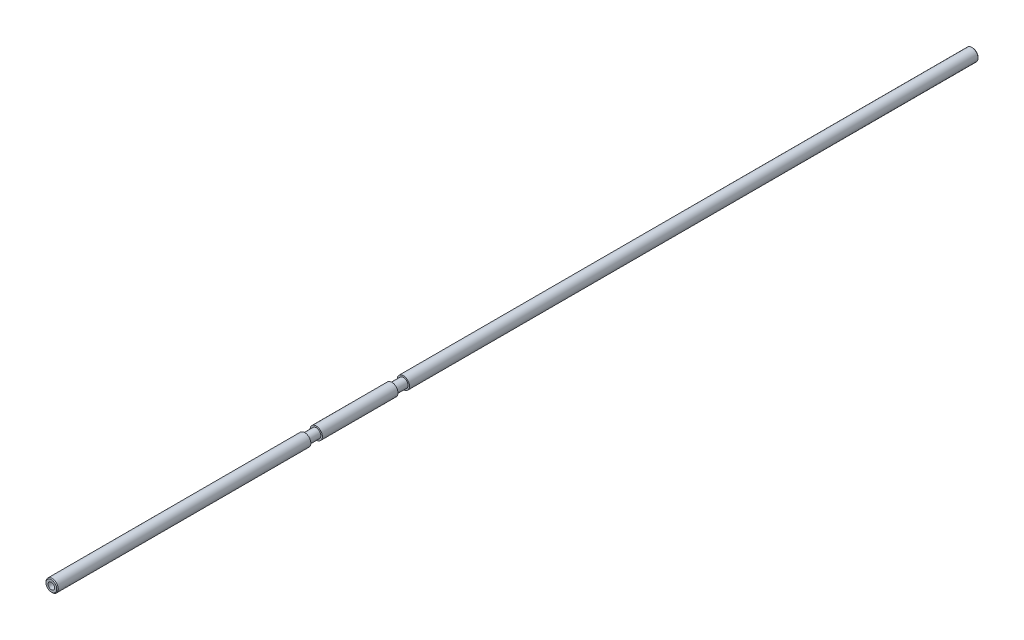
ISO-10303-21;
HEADER;
FILE_DESCRIPTION(('STEP AP214'),'2;1');
FILE_NAME('part.step','',(''),(''),'','','');
FILE_SCHEMA(('AUTOMOTIVE_DESIGN { 1 0 10303 214 1 1 1 1 }'));
ENDSEC;
DATA;
#1=APPLICATION_CONTEXT('core data for automotive mechanical design processes');
#2=APPLICATION_PROTOCOL_DEFINITION('international standard','automotive_design',2000,#1);
#3=PRODUCT_CONTEXT('',#1,'mechanical');
#4=PRODUCT('Part','Part','',(#3));
#5=PRODUCT_RELATED_PRODUCT_CATEGORY('part','',(#4));
#6=PRODUCT_DEFINITION_FORMATION('','',#4);
#7=PRODUCT_DEFINITION_CONTEXT('part definition',#1,'design');
#8=PRODUCT_DEFINITION('design','',#6,#7);
#9=PRODUCT_DEFINITION_SHAPE('','',#8);
#10=(LENGTH_UNIT() NAMED_UNIT(*) SI_UNIT(.MILLI.,.METRE.));
#11=(NAMED_UNIT(*) PLANE_ANGLE_UNIT() SI_UNIT($,.RADIAN.));
#12=(NAMED_UNIT(*) SI_UNIT($,.STERADIAN.) SOLID_ANGLE_UNIT());
#13=UNCERTAINTY_MEASURE_WITH_UNIT(LENGTH_MEASURE(1.E-05),#10,'distance_accuracy_value','');
#14=(GEOMETRIC_REPRESENTATION_CONTEXT(3) GLOBAL_UNCERTAINTY_ASSIGNED_CONTEXT((#13)) GLOBAL_UNIT_ASSIGNED_CONTEXT((#10,
#11,#12)) REPRESENTATION_CONTEXT('',''));
#15=CARTESIAN_POINT('',(0.,0.,0.));
#16=DIRECTION('',(0.,0.,1.));
#17=DIRECTION('',(1.,0.,0.));
#18=AXIS2_PLACEMENT_3D('',#15,#16,#17);
#19=CARTESIAN_POINT('',(45.,0.,1210.));
#20=DIRECTION('',(0.,0.,-1.));
#21=DIRECTION('',(-1.,0.,0.));
#22=AXIS2_PLACEMENT_3D('',#19,#20,#21);
#23=CYLINDRICAL_SURFACE('',#22,8.);
#24=CARTESIAN_POINT('',(45.,0.,766.5));
#25=DIRECTION('',(0.,0.,1.));
#26=DIRECTION('',(1.,0.,0.));
#27=AXIS2_PLACEMENT_3D('',#24,#25,#26);
#28=CIRCLE('',#27,8.);
#29=CARTESIAN_POINT('',(53.,0.,766.5));
#30=VERTEX_POINT('',#29);
#31=EDGE_CURVE('E73',#30,#30,#28,.T.);
#32=ORIENTED_EDGE('',*,*,#31,.T.);
#33=EDGE_LOOP('',(#32));
#34=FACE_BOUND('',#33,.T.);
#35=CARTESIAN_POINT('',(45.,0.,865.));
#36=DIRECTION('',(0.,0.,1.));
#37=DIRECTION('',(1.,0.,0.));
#38=AXIS2_PLACEMENT_3D('',#35,#36,#37);
#39=CIRCLE('',#38,8.);
#40=CARTESIAN_POINT('',(53.,0.,865.));
#41=VERTEX_POINT('',#40);
#42=EDGE_CURVE('E82',#41,#41,#39,.T.);
#43=ORIENTED_EDGE('',*,*,#42,.F.);
#44=EDGE_LOOP('',(#43));
#45=FACE_BOUND('',#44,.T.);
#46=ADVANCED_FACE('F39',(#34,#45),#23,.T.);
#47=CARTESIAN_POINT('',(45.,0.,10.9999999999997));
#48=DIRECTION('',(0.,0.,1.));
#49=DIRECTION('',(1.,0.,0.));
#50=AXIS2_PLACEMENT_3D('',#47,#48,#49);
#51=CIRCLE('',#50,8.);
#52=CARTESIAN_POINT('',(53.,0.,10.9999999999997));
#53=VERTEX_POINT('',#52);
#54=EDGE_CURVE('E51',#53,#53,#51,.T.);
#55=ORIENTED_EDGE('',*,*,#54,.T.);
#56=EDGE_LOOP('',(#55));
#57=FACE_BOUND('',#56,.T.);
#58=CARTESIAN_POINT('',(45.,0.,751.5));
#59=DIRECTION('',(0.,0.,1.));
#60=DIRECTION('',(1.,0.,0.));
#61=AXIS2_PLACEMENT_3D('',#58,#59,#60);
#62=CIRCLE('',#61,8.);
#63=CARTESIAN_POINT('',(53.,0.,751.5));
#64=VERTEX_POINT('',#63);
#65=EDGE_CURVE('E70',#64,#64,#62,.T.);
#66=ORIENTED_EDGE('',*,*,#65,.F.);
#67=EDGE_LOOP('',(#66));
#68=FACE_BOUND('',#67,.T.);
#69=ADVANCED_FACE('F109',(#57,#68),#23,.T.);
#70=CARTESIAN_POINT('',(45.,0.,10.));
#71=DIRECTION('',(0.,0.,1.));
#72=DIRECTION('',(1.,0.,0.));
#73=AXIS2_PLACEMENT_3D('',#70,#71,#72);
#74=PLANE('',#73);
#75=CARTESIAN_POINT('',(45.,0.,10.));
#76=DIRECTION('',(0.,0.,-1.));
#77=DIRECTION('',(-1.,0.,0.));
#78=AXIS2_PLACEMENT_3D('',#75,#76,#77);
#79=CIRCLE('',#78,4.25000000000001);
#80=CARTESIAN_POINT('',(40.75,0.,10.));
#81=VERTEX_POINT('',#80);
#82=EDGE_CURVE('E67',#81,#81,#79,.T.);
#83=ORIENTED_EDGE('',*,*,#82,.F.);
#84=EDGE_LOOP('',(#83));
#85=FACE_BOUND('',#84,.T.);
#86=CARTESIAN_POINT('',(45.,0.,10.));
#87=DIRECTION('',(0.,0.,1.));
#88=DIRECTION('',(1.,0.,0.));
#89=AXIS2_PLACEMENT_3D('',#86,#87,#88);
#90=CIRCLE('',#89,7.00000000000022);
#91=CARTESIAN_POINT('',(52.0000000000002,0.,10.));
#92=VERTEX_POINT('',#91);
#93=EDGE_CURVE('E10',#92,#92,#90,.F.);
#94=ORIENTED_EDGE('',*,*,#93,.T.);
#95=EDGE_LOOP('',(#94));
#96=FACE_BOUND('',#95,.T.);
#97=ADVANCED_FACE('F117',(#85,#96),#74,.F.);
#98=CARTESIAN_POINT('',(45.,0.,10.9999999999997));
#99=DIRECTION('',(0.,0.,1.));
#100=DIRECTION('',(1.,0.,0.));
#101=AXIS2_PLACEMENT_3D('',#98,#99,#100);
#102=CONICAL_SURFACE('',#101,8.,0.785398163397499);
#103=ORIENTED_EDGE('',*,*,#93,.F.);
#104=EDGE_LOOP('',(#103));
#105=FACE_BOUND('',#104,.T.);
#106=ORIENTED_EDGE('',*,*,#54,.F.);
#107=EDGE_LOOP('',(#106));
#108=FACE_BOUND('',#107,.T.);
#109=ADVANCED_FACE('F42',(#105,#108),#102,.T.);
#110=CARTESIAN_POINT('',(45.,0.,60.));
#111=DIRECTION('',(0.,0.,-1.));
#112=DIRECTION('',(-1.,0.,0.));
#113=AXIS2_PLACEMENT_3D('',#110,#111,#112);
#114=CYLINDRICAL_SURFACE('',#113,4.25000000000001);
#115=CARTESIAN_POINT('',(45.,0.,60.));
#116=DIRECTION('',(0.,0.,-1.));
#117=DIRECTION('',(-1.,0.,0.));
#118=AXIS2_PLACEMENT_3D('',#115,#116,#117);
#119=CIRCLE('',#118,4.25000000000001);
#120=CARTESIAN_POINT('',(40.75,0.,60.));
#121=VERTEX_POINT('',#120);
#122=EDGE_CURVE('E64',#121,#121,#119,.T.);
#123=ORIENTED_EDGE('',*,*,#122,.F.);
#124=EDGE_LOOP('',(#123));
#125=FACE_BOUND('',#124,.T.);
#126=ORIENTED_EDGE('',*,*,#82,.T.);
#127=EDGE_LOOP('',(#126));
#128=FACE_BOUND('',#127,.T.);
#129=ADVANCED_FACE('F152',(#125,#128),#114,.F.);
#130=CARTESIAN_POINT('',(45.,0.,60.));
#131=DIRECTION('',(0.,0.,-1.));
#132=DIRECTION('',(-1.,0.,0.));
#133=AXIS2_PLACEMENT_3D('',#130,#131,#132);
#134=PLANE('',#133);
#135=ORIENTED_EDGE('',*,*,#122,.T.);
#136=EDGE_LOOP('',(#135));
#137=FACE_BOUND('',#136,.T.);
#138=ADVANCED_FACE('F145',(#137),#134,.T.);
#139=CARTESIAN_POINT('',(45.,0.,751.5));
#140=DIRECTION('',(0.,0.,1.));
#141=DIRECTION('',(1.,0.,0.));
#142=AXIS2_PLACEMENT_3D('',#139,#140,#141);
#143=PLANE('',#142);
#144=CARTESIAN_POINT('',(45.,0.,751.5));
#145=DIRECTION('',(0.,0.,1.));
#146=DIRECTION('',(1.,0.,0.));
#147=AXIS2_PLACEMENT_3D('',#144,#145,#146);
#148=CIRCLE('',#147,6.);
#149=CARTESIAN_POINT('',(51.,0.,751.5));
#150=VERTEX_POINT('',#149);
#151=EDGE_CURVE('E76',#150,#150,#148,.T.);
#152=ORIENTED_EDGE('',*,*,#151,.F.);
#153=EDGE_LOOP('',(#152));
#154=FACE_BOUND('',#153,.T.);
#155=ORIENTED_EDGE('',*,*,#65,.T.);
#156=EDGE_LOOP('',(#155));
#157=FACE_BOUND('',#156,.T.);
#158=ADVANCED_FACE('F142',(#154,#157),#143,.T.);
#159=CARTESIAN_POINT('',(45.,0.,766.5));
#160=DIRECTION('',(0.,0.,1.));
#161=DIRECTION('',(1.,0.,0.));
#162=AXIS2_PLACEMENT_3D('',#159,#160,#161);
#163=PLANE('',#162);
#164=CARTESIAN_POINT('',(45.,0.,766.5));
#165=DIRECTION('',(0.,0.,1.));
#166=DIRECTION('',(1.,0.,0.));
#167=AXIS2_PLACEMENT_3D('',#164,#165,#166);
#168=CIRCLE('',#167,6.);
#169=CARTESIAN_POINT('',(51.,0.,766.5));
#170=VERTEX_POINT('',#169);
#171=EDGE_CURVE('E79',#170,#170,#168,.T.);
#172=ORIENTED_EDGE('',*,*,#171,.T.);
#173=EDGE_LOOP('',(#172));
#174=FACE_BOUND('',#173,.T.);
#175=ORIENTED_EDGE('',*,*,#31,.F.);
#176=EDGE_LOOP('',(#175));
#177=FACE_BOUND('',#176,.T.);
#178=ADVANCED_FACE('F140',(#174,#177),#163,.F.);
#179=CARTESIAN_POINT('',(45.,0.,751.5));
#180=DIRECTION('',(0.,0.,1.));
#181=DIRECTION('',(1.,0.,0.));
#182=AXIS2_PLACEMENT_3D('',#179,#180,#181);
#183=CYLINDRICAL_SURFACE('',#182,6.);
#184=ORIENTED_EDGE('',*,*,#151,.T.);
#185=EDGE_LOOP('',(#184));
#186=FACE_BOUND('',#185,.T.);
#187=ORIENTED_EDGE('',*,*,#171,.F.);
#188=EDGE_LOOP('',(#187));
#189=FACE_BOUND('',#188,.T.);
#190=ADVANCED_FACE('F104',(#186,#189),#183,.T.);
#191=CARTESIAN_POINT('',(45.,0.,865.));
#192=DIRECTION('',(0.,0.,1.));
#193=DIRECTION('',(1.,0.,0.));
#194=AXIS2_PLACEMENT_3D('',#191,#192,#193);
#195=PLANE('',#194);
#196=CARTESIAN_POINT('',(45.,0.,865.));
#197=DIRECTION('',(0.,0.,1.));
#198=DIRECTION('',(1.,0.,0.));
#199=AXIS2_PLACEMENT_3D('',#196,#197,#198);
#200=CIRCLE('',#199,6.);
#201=CARTESIAN_POINT('',(51.,0.,865.));
#202=VERTEX_POINT('',#201);
#203=EDGE_CURVE('E88',#202,#202,#200,.T.);
#204=ORIENTED_EDGE('',*,*,#203,.F.);
#205=EDGE_LOOP('',(#204));
#206=FACE_BOUND('',#205,.T.);
#207=ORIENTED_EDGE('',*,*,#42,.T.);
#208=EDGE_LOOP('',(#207));
#209=FACE_BOUND('',#208,.T.);
#210=ADVANCED_FACE('F100',(#206,#209),#195,.T.);
#211=CARTESIAN_POINT('',(45.,0.,880.));
#212=DIRECTION('',(0.,0.,1.));
#213=DIRECTION('',(1.,0.,0.));
#214=AXIS2_PLACEMENT_3D('',#211,#212,#213);
#215=PLANE('',#214);
#216=CARTESIAN_POINT('',(45.,0.,880.));
#217=DIRECTION('',(0.,0.,1.));
#218=DIRECTION('',(1.,0.,0.));
#219=AXIS2_PLACEMENT_3D('',#216,#217,#218);
#220=CIRCLE('',#219,6.);
#221=CARTESIAN_POINT('',(51.,0.,880.));
#222=VERTEX_POINT('',#221);
#223=EDGE_CURVE('E91',#222,#222,#220,.T.);
#224=ORIENTED_EDGE('',*,*,#223,.T.);
#225=EDGE_LOOP('',(#224));
#226=FACE_BOUND('',#225,.T.);
#227=CARTESIAN_POINT('',(45.,0.,880.));
#228=DIRECTION('',(0.,0.,1.));
#229=DIRECTION('',(1.,0.,0.));
#230=AXIS2_PLACEMENT_3D('',#227,#228,#229);
#231=CIRCLE('',#230,8.);
#232=CARTESIAN_POINT('',(53.,0.,880.));
#233=VERTEX_POINT('',#232);
#234=EDGE_CURVE('E85',#233,#233,#231,.T.);
#235=ORIENTED_EDGE('',*,*,#234,.F.);
#236=EDGE_LOOP('',(#235));
#237=FACE_BOUND('',#236,.T.);
#238=ADVANCED_FACE('F103',(#226,#237),#215,.F.);
#239=CARTESIAN_POINT('',(45.,0.,865.));
#240=DIRECTION('',(0.,0.,1.));
#241=DIRECTION('',(1.,0.,0.));
#242=AXIS2_PLACEMENT_3D('',#239,#240,#241);
#243=CYLINDRICAL_SURFACE('',#242,6.);
#244=ORIENTED_EDGE('',*,*,#203,.T.);
#245=EDGE_LOOP('',(#244));
#246=FACE_BOUND('',#245,.T.);
#247=ORIENTED_EDGE('',*,*,#223,.F.);
#248=EDGE_LOOP('',(#247));
#249=FACE_BOUND('',#248,.T.);
#250=ADVANCED_FACE('F97',(#246,#249),#243,.T.);
#251=CARTESIAN_POINT('',(45.,0.,1160.));
#252=DIRECTION('',(0.,0.,1.));
#253=DIRECTION('',(1.,0.,0.));
#254=AXIS2_PLACEMENT_3D('',#251,#252,#253);
#255=PLANE('',#254);
#256=CARTESIAN_POINT('',(45.,0.,1160.));
#257=DIRECTION('',(0.,0.,1.));
#258=DIRECTION('',(1.,0.,0.));
#259=AXIS2_PLACEMENT_3D('',#256,#257,#258);
#260=CIRCLE('',#259,4.25000000000001);
#261=CARTESIAN_POINT('',(49.25,0.,1160.));
#262=VERTEX_POINT('',#261);
#263=EDGE_CURVE('E60',#262,#262,#260,.T.);
#264=ORIENTED_EDGE('',*,*,#263,.T.);
#265=EDGE_LOOP('',(#264));
#266=FACE_BOUND('',#265,.T.);
#267=ADVANCED_FACE('F136',(#266),#255,.T.);
#268=CARTESIAN_POINT('',(45.,0.,1160.));
#269=DIRECTION('',(0.,0.,1.));
#270=DIRECTION('',(1.,0.,0.));
#271=AXIS2_PLACEMENT_3D('',#268,#269,#270);
#272=CYLINDRICAL_SURFACE('',#271,4.25000000000001);
#273=ORIENTED_EDGE('',*,*,#263,.F.);
#274=EDGE_LOOP('',(#273));
#275=FACE_BOUND('',#274,.T.);
#276=CARTESIAN_POINT('',(45.,0.,1210.));
#277=DIRECTION('',(0.,0.,1.));
#278=DIRECTION('',(1.,0.,0.));
#279=AXIS2_PLACEMENT_3D('',#276,#277,#278);
#280=CIRCLE('',#279,4.25000000000001);
#281=CARTESIAN_POINT('',(49.25,0.,1210.));
#282=VERTEX_POINT('',#281);
#283=EDGE_CURVE('E61',#282,#282,#280,.T.);
#284=ORIENTED_EDGE('',*,*,#283,.T.);
#285=EDGE_LOOP('',(#284));
#286=FACE_BOUND('',#285,.T.);
#287=ADVANCED_FACE('F159',(#275,#286),#272,.F.);
#288=CARTESIAN_POINT('',(45.,0.,1210.));
#289=DIRECTION('',(0.,0.,1.));
#290=DIRECTION('',(1.,0.,0.));
#291=AXIS2_PLACEMENT_3D('',#288,#289,#290);
#292=PLANE('',#291);
#293=ORIENTED_EDGE('',*,*,#283,.F.);
#294=EDGE_LOOP('',(#293));
#295=FACE_BOUND('',#294,.T.);
#296=CARTESIAN_POINT('',(45.,0.,1210.));
#297=DIRECTION('',(0.,0.,1.));
#298=DIRECTION('',(1.,0.,0.));
#299=AXIS2_PLACEMENT_3D('',#296,#297,#298);
#300=CIRCLE('',#299,7.00000000000045);
#301=CARTESIAN_POINT('',(52.0000000000004,0.,1210.));
#302=VERTEX_POINT('',#301);
#303=EDGE_CURVE('E55',#302,#302,#300,.T.);
#304=ORIENTED_EDGE('',*,*,#303,.T.);
#305=EDGE_LOOP('',(#304));
#306=FACE_BOUND('',#305,.T.);
#307=ADVANCED_FACE('F127',(#295,#306),#292,.T.);
#308=CARTESIAN_POINT('',(45.,0.,1210.));
#309=DIRECTION('',(0.,0.,-1.));
#310=DIRECTION('',(-1.,0.,0.));
#311=AXIS2_PLACEMENT_3D('',#308,#309,#310);
#312=CONICAL_SURFACE('',#311,7.00000000000045,0.785398163397499);
#313=CARTESIAN_POINT('',(45.,0.,1209.));
#314=DIRECTION('',(0.,0.,1.));
#315=DIRECTION('',(1.,0.,0.));
#316=AXIS2_PLACEMENT_3D('',#313,#314,#315);
#317=CIRCLE('',#316,8.);
#318=CARTESIAN_POINT('',(53.,0.,1209.));
#319=VERTEX_POINT('',#318);
#320=EDGE_CURVE('E47',#319,#319,#317,.F.);
#321=ORIENTED_EDGE('',*,*,#320,.F.);
#322=EDGE_LOOP('',(#321));
#323=FACE_BOUND('',#322,.T.);
#324=ORIENTED_EDGE('',*,*,#303,.F.);
#325=EDGE_LOOP('',(#324));
#326=FACE_BOUND('',#325,.T.);
#327=ADVANCED_FACE('F121',(#323,#326),#312,.T.);
#328=ORIENTED_EDGE('',*,*,#234,.T.);
#329=EDGE_LOOP('',(#328));
#330=FACE_BOUND('',#329,.T.);
#331=ORIENTED_EDGE('',*,*,#320,.T.);
#332=EDGE_LOOP('',(#331));
#333=FACE_BOUND('',#332,.T.);
#334=ADVANCED_FACE('F112',(#330,#333),#23,.T.);
#335=CLOSED_SHELL('',(#46,#69,#97,#109,#129,#138,#158,#178,#190,#210,#238,#250,#267,#287,#307,
#327,#334));
#336=MANIFOLD_SOLID_BREP('B2',#335);
#337=ADVANCED_BREP_SHAPE_REPRESENTATION('',(#18,#336),#14);
#338=SHAPE_DEFINITION_REPRESENTATION(#9,#337);
ENDSEC;
END-ISO-10303-21;
